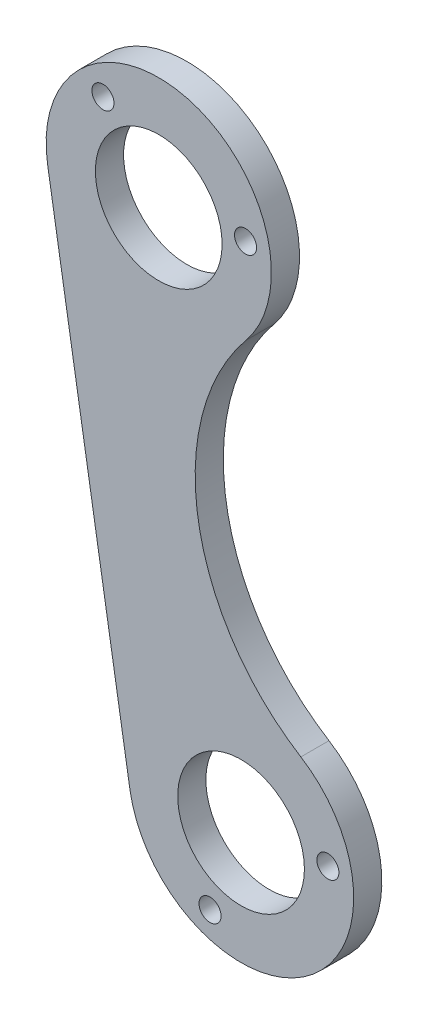
ISO-10303-21;
HEADER;
FILE_DESCRIPTION(('STEP AP214'),'2;1');
FILE_NAME('part.step','',(''),(''),'','','');
FILE_SCHEMA(('AUTOMOTIVE_DESIGN { 1 0 10303 214 1 1 1 1 }'));
ENDSEC;
DATA;
#1=APPLICATION_CONTEXT('core data for automotive mechanical design processes');
#2=APPLICATION_PROTOCOL_DEFINITION('international standard','automotive_design',2000,#1);
#3=PRODUCT_CONTEXT('',#1,'mechanical');
#4=PRODUCT('Part','Part','',(#3));
#5=PRODUCT_RELATED_PRODUCT_CATEGORY('part','',(#4));
#6=PRODUCT_DEFINITION_FORMATION('','',#4);
#7=PRODUCT_DEFINITION_CONTEXT('part definition',#1,'design');
#8=PRODUCT_DEFINITION('design','',#6,#7);
#9=PRODUCT_DEFINITION_SHAPE('','',#8);
#10=(LENGTH_UNIT() NAMED_UNIT(*) SI_UNIT(.MILLI.,.METRE.));
#11=(NAMED_UNIT(*) PLANE_ANGLE_UNIT() SI_UNIT($,.RADIAN.));
#12=(NAMED_UNIT(*) SI_UNIT($,.STERADIAN.) SOLID_ANGLE_UNIT());
#13=UNCERTAINTY_MEASURE_WITH_UNIT(LENGTH_MEASURE(1.E-05),#10,'distance_accuracy_value','');
#14=(GEOMETRIC_REPRESENTATION_CONTEXT(3) GLOBAL_UNCERTAINTY_ASSIGNED_CONTEXT((#13)) GLOBAL_UNIT_ASSIGNED_CONTEXT((#10,
#11,#12)) REPRESENTATION_CONTEXT('',''));
#15=CARTESIAN_POINT('',(0.,0.,0.));
#16=DIRECTION('',(0.,0.,1.));
#17=DIRECTION('',(1.,0.,0.));
#18=AXIS2_PLACEMENT_3D('',#15,#16,#17);
#19=CARTESIAN_POINT('',(694.038240270327,306.795958923562,3.175));
#20=DIRECTION('',(0.,0.,1.));
#21=DIRECTION('',(1.,0.,0.));
#22=AXIS2_PLACEMENT_3D('',#19,#20,#21);
#23=PLANE('',#22);
#24=CARTESIAN_POINT('',(635.023351974409,355.00055371929,3.175));
#25=DIRECTION('',(0.,0.,1.));
#26=DIRECTION('',(1.,0.,0.));
#27=AXIS2_PLACEMENT_3D('',#24,#25,#26);
#28=CIRCLE('',#27,14.2875);
#29=CARTESIAN_POINT('',(649.310851974409,355.00055371929,3.175));
#30=VERTEX_POINT('',#29);
#31=EDGE_CURVE('E137',#30,#30,#28,.T.);
#32=ORIENTED_EDGE('',*,*,#31,.F.);
#33=EDGE_LOOP('',(#32));
#34=FACE_BOUND('',#33,.T.);
#35=CARTESIAN_POINT('',(654.603593020532,358.223684904682,3.175));
#36=DIRECTION('',(0.,0.,1.));
#37=DIRECTION('',(1.,0.,0.));
#38=AXIS2_PLACEMENT_3D('',#35,#36,#37);
#39=CIRCLE('',#38,2.48919999999995);
#40=CARTESIAN_POINT('',(657.092793020532,358.223684904682,3.175));
#41=VERTEX_POINT('',#40);
#42=EDGE_CURVE('E125',#41,#41,#39,.T.);
#43=ORIENTED_EDGE('',*,*,#42,.F.);
#44=EDGE_LOOP('',(#43));
#45=FACE_BOUND('',#44,.T.);
#46=CARTESIAN_POINT('',(673.168828648389,245.441496479017,3.175));
#47=DIRECTION('',(0.,0.,1.));
#48=DIRECTION('',(1.,0.,0.));
#49=AXIS2_PLACEMENT_3D('',#46,#47,#48);
#50=CIRCLE('',#49,2.48919999999998);
#51=CARTESIAN_POINT('',(675.658028648389,245.441496479017,3.175));
#52=VERTEX_POINT('',#51);
#53=EDGE_CURVE('E104',#52,#52,#50,.T.);
#54=ORIENTED_EDGE('',*,*,#53,.F.);
#55=EDGE_LOOP('',(#54));
#56=FACE_BOUND('',#55,.T.);
#57=CARTESIAN_POINT('',(694.038240270327,306.795958923562,3.175));
#58=DIRECTION('',(0.,0.,-1.));
#59=DIRECTION('',(1.,0.,0.));
#60=AXIS2_PLACEMENT_3D('',#57,#58,#59);
#61=CIRCLE('',#60,50.8);
#62=CARTESIAN_POINT('',(667.071805158287,263.744229836938,3.175));
#63=VERTEX_POINT('',#62);
#64=CARTESIAN_POINT('',(654.694981406382,338.932355454048,3.175));
#65=VERTEX_POINT('',#64);
#66=EDGE_CURVE('E89',#63,#65,#61,.T.);
#67=ORIENTED_EDGE('',*,*,#66,.T.);
#68=CARTESIAN_POINT('',(635.023351974409,355.00055371929,3.175));
#69=DIRECTION('',(0.,0.,1.));
#70=DIRECTION('',(-1.,0.,0.));
#71=AXIS2_PLACEMENT_3D('',#68,#69,#70);
#72=CIRCLE('',#71,25.4);
#73=CARTESIAN_POINT('',(609.960643435373,350.874945801988,3.175));
#74=VERTEX_POINT('',#73);
#75=EDGE_CURVE('E84',#65,#74,#72,.T.);
#76=ORIENTED_EDGE('',*,*,#75,.T.);
#77=DIRECTION('',(0.162425508555187,-0.986720808623487,0.));
#78=VECTOR('',#77,1.);
#79=CARTESIAN_POINT('',(628.52587906323,238.092757376324,3.175));
#80=LINE('',#79,#78);
#81=CARTESIAN_POINT('',(628.52587906323,238.092757376324,3.175));
#82=VERTEX_POINT('',#81);
#83=EDGE_CURVE('E87',#74,#82,#80,.T.);
#84=ORIENTED_EDGE('',*,*,#83,.T.);
#85=CARTESIAN_POINT('',(653.588587602267,242.218365293625,3.175));
#86=DIRECTION('',(0.,0.,1.));
#87=DIRECTION('',(-1.,0.,0.));
#88=AXIS2_PLACEMENT_3D('',#85,#86,#87);
#89=CIRCLE('',#88,25.3999999999999);
#90=EDGE_CURVE('E54',#82,#63,#89,.T.);
#91=ORIENTED_EDGE('',*,*,#90,.T.);
#92=EDGE_LOOP('',(#67,#76,#84,#91));
#93=FACE_BOUND('',#92,.T.);
#94=CARTESIAN_POINT('',(646.589780565486,223.649813542764,3.175));
#95=DIRECTION('',(0.,0.,1.));
#96=DIRECTION('',(1.,0.,0.));
#97=AXIS2_PLACEMENT_3D('',#94,#95,#96);
#98=CIRCLE('',#97,2.48920000000039);
#99=CARTESIAN_POINT('',(649.078980565486,223.649813542764,3.175));
#100=VERTEX_POINT('',#99);
#101=EDGE_CURVE('E119',#100,#100,#98,.T.);
#102=ORIENTED_EDGE('',*,*,#101,.F.);
#103=EDGE_LOOP('',(#102));
#104=FACE_BOUND('',#103,.T.);
#105=CARTESIAN_POINT('',(622.441917965069,370.345974284759,3.175));
#106=DIRECTION('',(0.,0.,1.));
#107=DIRECTION('',(1.,0.,0.));
#108=AXIS2_PLACEMENT_3D('',#105,#106,#107);
#109=CIRCLE('',#108,2.48919999999995);
#110=CARTESIAN_POINT('',(624.931117965069,370.345974284759,3.175));
#111=VERTEX_POINT('',#110);
#112=EDGE_CURVE('E131',#111,#111,#109,.T.);
#113=ORIENTED_EDGE('',*,*,#112,.F.);
#114=EDGE_LOOP('',(#113));
#115=FACE_BOUND('',#114,.T.);
#116=CARTESIAN_POINT('',(653.588587602267,242.218365293625,3.175));
#117=DIRECTION('',(0.,0.,1.));
#118=DIRECTION('',(1.,0.,0.));
#119=AXIS2_PLACEMENT_3D('',#116,#117,#118);
#120=CIRCLE('',#119,14.2875);
#121=CARTESIAN_POINT('',(667.876087602267,242.218365293625,3.175));
#122=VERTEX_POINT('',#121);
#123=EDGE_CURVE('E143',#122,#122,#120,.T.);
#124=ORIENTED_EDGE('',*,*,#123,.F.);
#125=EDGE_LOOP('',(#124));
#126=FACE_BOUND('',#125,.T.);
#127=ADVANCED_FACE('F37',(#34,#45,#56,#93,#104,#115,#126),#23,.T.);
#128=CARTESIAN_POINT('',(694.038240270327,306.795958923562,-3.175));
#129=DIRECTION('',(0.,0.,1.));
#130=DIRECTION('',(1.,0.,0.));
#131=AXIS2_PLACEMENT_3D('',#128,#129,#130);
#132=PLANE('',#131);
#133=CARTESIAN_POINT('',(694.038240270327,306.795958923562,-3.175));
#134=DIRECTION('',(0.,0.,-1.));
#135=DIRECTION('',(1.,0.,0.));
#136=AXIS2_PLACEMENT_3D('',#133,#134,#135);
#137=CIRCLE('',#136,50.8);
#138=CARTESIAN_POINT('',(667.071805158287,263.744229836938,-3.175));
#139=VERTEX_POINT('',#138);
#140=CARTESIAN_POINT('',(654.694981406382,338.932355454048,-3.175));
#141=VERTEX_POINT('',#140);
#142=EDGE_CURVE('E101',#139,#141,#137,.T.);
#143=ORIENTED_EDGE('',*,*,#142,.F.);
#144=CARTESIAN_POINT('',(653.588587602267,242.218365293625,-3.175));
#145=DIRECTION('',(0.,0.,1.));
#146=DIRECTION('',(-1.,0.,0.));
#147=AXIS2_PLACEMENT_3D('',#144,#145,#146);
#148=CIRCLE('',#147,25.3999999999999);
#149=CARTESIAN_POINT('',(628.52587906323,238.092757376324,-3.175));
#150=VERTEX_POINT('',#149);
#151=EDGE_CURVE('E77',#150,#139,#148,.T.);
#152=ORIENTED_EDGE('',*,*,#151,.F.);
#153=DIRECTION('',(0.162425508555187,-0.986720808623487,0.));
#154=VECTOR('',#153,1.);
#155=CARTESIAN_POINT('',(628.52587906323,238.092757376324,-3.175));
#156=LINE('',#155,#154);
#157=CARTESIAN_POINT('',(609.960643435373,350.874945801988,-3.175));
#158=VERTEX_POINT('',#157);
#159=EDGE_CURVE('E71',#158,#150,#156,.T.);
#160=ORIENTED_EDGE('',*,*,#159,.F.);
#161=CARTESIAN_POINT('',(635.023351974409,355.00055371929,-3.175));
#162=DIRECTION('',(0.,0.,1.));
#163=DIRECTION('',(-1.,0.,0.));
#164=AXIS2_PLACEMENT_3D('',#161,#162,#163);
#165=CIRCLE('',#164,25.4);
#166=EDGE_CURVE('E93',#141,#158,#165,.T.);
#167=ORIENTED_EDGE('',*,*,#166,.F.);
#168=EDGE_LOOP('',(#143,#152,#160,#167));
#169=FACE_BOUND('',#168,.T.);
#170=CARTESIAN_POINT('',(673.168828648389,245.441496479017,-3.175));
#171=DIRECTION('',(0.,0.,1.));
#172=DIRECTION('',(1.,0.,0.));
#173=AXIS2_PLACEMENT_3D('',#170,#171,#172);
#174=CIRCLE('',#173,2.48919999999998);
#175=CARTESIAN_POINT('',(675.658028648389,245.441496479017,-3.175));
#176=VERTEX_POINT('',#175);
#177=EDGE_CURVE('E116',#176,#176,#174,.T.);
#178=ORIENTED_EDGE('',*,*,#177,.T.);
#179=EDGE_LOOP('',(#178));
#180=FACE_BOUND('',#179,.T.);
#181=CARTESIAN_POINT('',(646.589780565486,223.649813542764,-3.175));
#182=DIRECTION('',(0.,0.,1.));
#183=DIRECTION('',(1.,0.,0.));
#184=AXIS2_PLACEMENT_3D('',#181,#182,#183);
#185=CIRCLE('',#184,2.48920000000039);
#186=CARTESIAN_POINT('',(649.078980565486,223.649813542764,-3.175));
#187=VERTEX_POINT('',#186);
#188=EDGE_CURVE('E122',#187,#187,#185,.T.);
#189=ORIENTED_EDGE('',*,*,#188,.T.);
#190=EDGE_LOOP('',(#189));
#191=FACE_BOUND('',#190,.T.);
#192=CARTESIAN_POINT('',(654.603593020532,358.223684904682,-3.175));
#193=DIRECTION('',(0.,0.,1.));
#194=DIRECTION('',(1.,0.,0.));
#195=AXIS2_PLACEMENT_3D('',#192,#193,#194);
#196=CIRCLE('',#195,2.48919999999995);
#197=CARTESIAN_POINT('',(657.092793020532,358.223684904682,-3.175));
#198=VERTEX_POINT('',#197);
#199=EDGE_CURVE('E128',#198,#198,#196,.T.);
#200=ORIENTED_EDGE('',*,*,#199,.T.);
#201=EDGE_LOOP('',(#200));
#202=FACE_BOUND('',#201,.T.);
#203=CARTESIAN_POINT('',(622.441917965069,370.345974284759,-3.175));
#204=DIRECTION('',(0.,0.,1.));
#205=DIRECTION('',(1.,0.,0.));
#206=AXIS2_PLACEMENT_3D('',#203,#204,#205);
#207=CIRCLE('',#206,2.48919999999995);
#208=CARTESIAN_POINT('',(624.931117965069,370.345974284759,-3.175));
#209=VERTEX_POINT('',#208);
#210=EDGE_CURVE('E134',#209,#209,#207,.T.);
#211=ORIENTED_EDGE('',*,*,#210,.T.);
#212=EDGE_LOOP('',(#211));
#213=FACE_BOUND('',#212,.T.);
#214=CARTESIAN_POINT('',(635.023351974409,355.00055371929,-3.175));
#215=DIRECTION('',(0.,0.,1.));
#216=DIRECTION('',(1.,0.,0.));
#217=AXIS2_PLACEMENT_3D('',#214,#215,#216);
#218=CIRCLE('',#217,14.2875);
#219=CARTESIAN_POINT('',(649.310851974409,355.00055371929,-3.175));
#220=VERTEX_POINT('',#219);
#221=EDGE_CURVE('E140',#220,#220,#218,.T.);
#222=ORIENTED_EDGE('',*,*,#221,.T.);
#223=EDGE_LOOP('',(#222));
#224=FACE_BOUND('',#223,.T.);
#225=CARTESIAN_POINT('',(653.588587602267,242.218365293625,-3.175));
#226=DIRECTION('',(0.,0.,1.));
#227=DIRECTION('',(1.,0.,0.));
#228=AXIS2_PLACEMENT_3D('',#225,#226,#227);
#229=CIRCLE('',#228,14.2875);
#230=CARTESIAN_POINT('',(667.876087602267,242.218365293625,-3.175));
#231=VERTEX_POINT('',#230);
#232=EDGE_CURVE('E146',#231,#231,#229,.T.);
#233=ORIENTED_EDGE('',*,*,#232,.T.);
#234=EDGE_LOOP('',(#233));
#235=FACE_BOUND('',#234,.T.);
#236=ADVANCED_FACE('F112',(#169,#180,#191,#202,#213,#224,#235),#132,.F.);
#237=CARTESIAN_POINT('',(694.038240270327,306.795958923562,3.175));
#238=DIRECTION('',(0.,0.,-1.));
#239=DIRECTION('',(-1.,0.,0.));
#240=AXIS2_PLACEMENT_3D('',#237,#238,#239);
#241=CYLINDRICAL_SURFACE('',#240,50.8);
#242=ORIENTED_EDGE('',*,*,#142,.T.);
#243=DIRECTION('',(0.,0.,-1.));
#244=VECTOR('',#243,1.);
#245=CARTESIAN_POINT('',(654.694981406382,338.932355454048,3.175));
#246=LINE('',#245,#244);
#247=EDGE_CURVE('E11',#65,#141,#246,.T.);
#248=ORIENTED_EDGE('',*,*,#247,.F.);
#249=ORIENTED_EDGE('',*,*,#66,.F.);
#250=DIRECTION('',(0.,0.,-1.));
#251=VECTOR('',#250,1.);
#252=CARTESIAN_POINT('',(667.071805158287,263.744229836938,3.175));
#253=LINE('',#252,#251);
#254=EDGE_CURVE('E97',#63,#139,#253,.T.);
#255=ORIENTED_EDGE('',*,*,#254,.T.);
#256=EDGE_LOOP('',(#242,#248,#249,#255));
#257=FACE_BOUND('',#256,.T.);
#258=ADVANCED_FACE('F39',(#257),#241,.F.);
#259=CARTESIAN_POINT('',(635.023351974409,355.00055371929,3.175));
#260=DIRECTION('',(0.,0.,-1.));
#261=DIRECTION('',(-1.,0.,0.));
#262=AXIS2_PLACEMENT_3D('',#259,#260,#261);
#263=CYLINDRICAL_SURFACE('',#262,25.4);
#264=ORIENTED_EDGE('',*,*,#166,.T.);
#265=DIRECTION('',(0.,0.,-1.));
#266=VECTOR('',#265,1.);
#267=CARTESIAN_POINT('',(609.960643435373,350.874945801988,3.175));
#268=LINE('',#267,#266);
#269=EDGE_CURVE('E46',#74,#158,#268,.T.);
#270=ORIENTED_EDGE('',*,*,#269,.F.);
#271=ORIENTED_EDGE('',*,*,#75,.F.);
#272=ORIENTED_EDGE('',*,*,#247,.T.);
#273=EDGE_LOOP('',(#264,#270,#271,#272));
#274=FACE_BOUND('',#273,.T.);
#275=ADVANCED_FACE('F92',(#274),#263,.T.);
#276=CARTESIAN_POINT('',(628.52587906323,238.092757376324,3.175));
#277=DIRECTION('',(0.986720808623487,0.162425508555187,0.));
#278=DIRECTION('',(-0.162425508555187,0.986720808623487,0.));
#279=AXIS2_PLACEMENT_3D('',#276,#277,#278);
#280=PLANE('',#279);
#281=ORIENTED_EDGE('',*,*,#159,.T.);
#282=DIRECTION('',(0.,0.,-1.));
#283=VECTOR('',#282,1.);
#284=CARTESIAN_POINT('',(628.52587906323,238.092757376324,3.175));
#285=LINE('',#284,#283);
#286=EDGE_CURVE('E94',#82,#150,#285,.T.);
#287=ORIENTED_EDGE('',*,*,#286,.F.);
#288=ORIENTED_EDGE('',*,*,#83,.F.);
#289=ORIENTED_EDGE('',*,*,#269,.T.);
#290=EDGE_LOOP('',(#281,#287,#288,#289));
#291=FACE_BOUND('',#290,.T.);
#292=ADVANCED_FACE('F95',(#291),#280,.F.);
#293=CARTESIAN_POINT('',(653.588587602267,242.218365293625,3.175));
#294=DIRECTION('',(0.,0.,-1.));
#295=DIRECTION('',(-1.,0.,0.));
#296=AXIS2_PLACEMENT_3D('',#293,#294,#295);
#297=CYLINDRICAL_SURFACE('',#296,25.3999999999999);
#298=ORIENTED_EDGE('',*,*,#151,.T.);
#299=ORIENTED_EDGE('',*,*,#254,.F.);
#300=ORIENTED_EDGE('',*,*,#90,.F.);
#301=ORIENTED_EDGE('',*,*,#286,.T.);
#302=EDGE_LOOP('',(#298,#299,#300,#301));
#303=FACE_BOUND('',#302,.T.);
#304=ADVANCED_FACE('F109',(#303),#297,.T.);
#305=CARTESIAN_POINT('',(673.168828648389,245.441496479017,3.175));
#306=DIRECTION('',(0.,0.,-1.));
#307=DIRECTION('',(-1.,0.,0.));
#308=AXIS2_PLACEMENT_3D('',#305,#306,#307);
#309=CYLINDRICAL_SURFACE('',#308,2.48919999999998);
#310=ORIENTED_EDGE('',*,*,#53,.T.);
#311=EDGE_LOOP('',(#310));
#312=FACE_BOUND('',#311,.T.);
#313=ORIENTED_EDGE('',*,*,#177,.F.);
#314=EDGE_LOOP('',(#313));
#315=FACE_BOUND('',#314,.T.);
#316=ADVANCED_FACE('F165',(#312,#315),#309,.F.);
#317=CARTESIAN_POINT('',(646.589780565486,223.649813542764,3.175));
#318=DIRECTION('',(0.,0.,-1.));
#319=DIRECTION('',(-1.,0.,0.));
#320=AXIS2_PLACEMENT_3D('',#317,#318,#319);
#321=CYLINDRICAL_SURFACE('',#320,2.48920000000039);
#322=ORIENTED_EDGE('',*,*,#101,.T.);
#323=EDGE_LOOP('',(#322));
#324=FACE_BOUND('',#323,.T.);
#325=ORIENTED_EDGE('',*,*,#188,.F.);
#326=EDGE_LOOP('',(#325));
#327=FACE_BOUND('',#326,.T.);
#328=ADVANCED_FACE('F219',(#324,#327),#321,.F.);
#329=CARTESIAN_POINT('',(654.603593020532,358.223684904682,3.175));
#330=DIRECTION('',(0.,0.,-1.));
#331=DIRECTION('',(-1.,0.,0.));
#332=AXIS2_PLACEMENT_3D('',#329,#330,#331);
#333=CYLINDRICAL_SURFACE('',#332,2.48919999999995);
#334=ORIENTED_EDGE('',*,*,#42,.T.);
#335=EDGE_LOOP('',(#334));
#336=FACE_BOUND('',#335,.T.);
#337=ORIENTED_EDGE('',*,*,#199,.F.);
#338=EDGE_LOOP('',(#337));
#339=FACE_BOUND('',#338,.T.);
#340=ADVANCED_FACE('F228',(#336,#339),#333,.F.);
#341=CARTESIAN_POINT('',(622.441917965069,370.345974284759,3.175));
#342=DIRECTION('',(0.,0.,-1.));
#343=DIRECTION('',(-1.,0.,0.));
#344=AXIS2_PLACEMENT_3D('',#341,#342,#343);
#345=CYLINDRICAL_SURFACE('',#344,2.48919999999995);
#346=ORIENTED_EDGE('',*,*,#112,.T.);
#347=EDGE_LOOP('',(#346));
#348=FACE_BOUND('',#347,.T.);
#349=ORIENTED_EDGE('',*,*,#210,.F.);
#350=EDGE_LOOP('',(#349));
#351=FACE_BOUND('',#350,.T.);
#352=ADVANCED_FACE('F237',(#348,#351),#345,.F.);
#353=CARTESIAN_POINT('',(635.023351974409,355.00055371929,3.175));
#354=DIRECTION('',(0.,0.,-1.));
#355=DIRECTION('',(-1.,0.,0.));
#356=AXIS2_PLACEMENT_3D('',#353,#354,#355);
#357=CYLINDRICAL_SURFACE('',#356,14.2875);
#358=ORIENTED_EDGE('',*,*,#31,.T.);
#359=EDGE_LOOP('',(#358));
#360=FACE_BOUND('',#359,.T.);
#361=ORIENTED_EDGE('',*,*,#221,.F.);
#362=EDGE_LOOP('',(#361));
#363=FACE_BOUND('',#362,.T.);
#364=ADVANCED_FACE('F247',(#360,#363),#357,.F.);
#365=CARTESIAN_POINT('',(653.588587602267,242.218365293625,3.175));
#366=DIRECTION('',(0.,0.,-1.));
#367=DIRECTION('',(-1.,0.,0.));
#368=AXIS2_PLACEMENT_3D('',#365,#366,#367);
#369=CYLINDRICAL_SURFACE('',#368,14.2875);
#370=ORIENTED_EDGE('',*,*,#123,.T.);
#371=EDGE_LOOP('',(#370));
#372=FACE_BOUND('',#371,.T.);
#373=ORIENTED_EDGE('',*,*,#232,.F.);
#374=EDGE_LOOP('',(#373));
#375=FACE_BOUND('',#374,.T.);
#376=ADVANCED_FACE('F152',(#372,#375),#369,.F.);
#377=CLOSED_SHELL('',(#127,#236,#258,#275,#292,#304,#316,#328,#340,#352,#364,#376));
#378=MANIFOLD_SOLID_BREP('B2',#377);
#379=ADVANCED_BREP_SHAPE_REPRESENTATION('',(#18,#378),#14);
#380=SHAPE_DEFINITION_REPRESENTATION(#9,#379);
ENDSEC;
END-ISO-10303-21;
